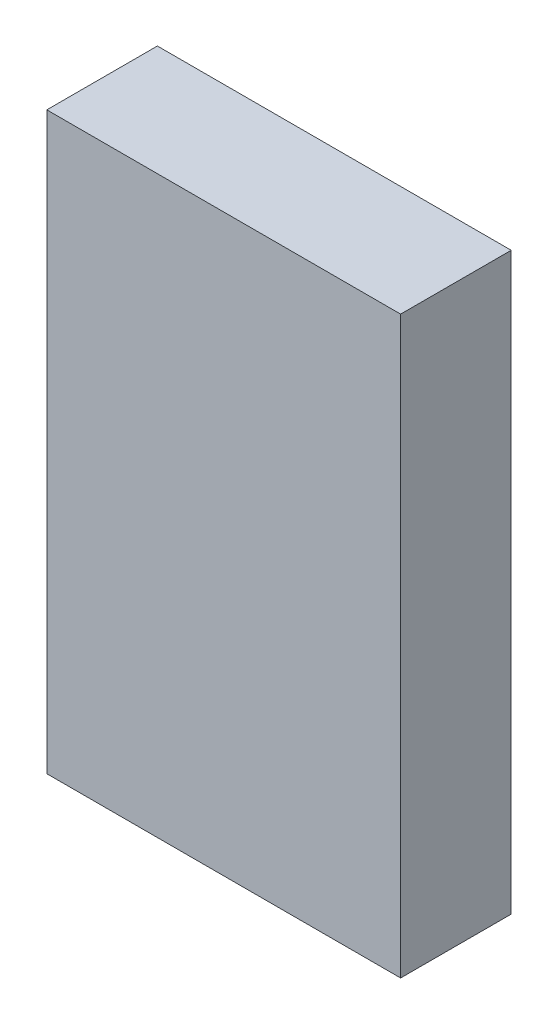
ISO-10303-21;
HEADER;
FILE_DESCRIPTION(('STEP AP214'),'2;1');
FILE_NAME('part.step','',(''),(''),'','','');
FILE_SCHEMA(('AUTOMOTIVE_DESIGN { 1 0 10303 214 1 1 1 1 }'));
ENDSEC;
DATA;
#1=APPLICATION_CONTEXT('core data for automotive mechanical design processes');
#2=APPLICATION_PROTOCOL_DEFINITION('international standard','automotive_design',2000,#1);
#3=PRODUCT_CONTEXT('',#1,'mechanical');
#4=PRODUCT('Part','Part','',(#3));
#5=PRODUCT_RELATED_PRODUCT_CATEGORY('part','',(#4));
#6=PRODUCT_DEFINITION_FORMATION('','',#4);
#7=PRODUCT_DEFINITION_CONTEXT('part definition',#1,'design');
#8=PRODUCT_DEFINITION('design','',#6,#7);
#9=PRODUCT_DEFINITION_SHAPE('','',#8);
#10=(LENGTH_UNIT() NAMED_UNIT(*) SI_UNIT(.MILLI.,.METRE.));
#11=(NAMED_UNIT(*) PLANE_ANGLE_UNIT() SI_UNIT($,.RADIAN.));
#12=(NAMED_UNIT(*) SI_UNIT($,.STERADIAN.) SOLID_ANGLE_UNIT());
#13=UNCERTAINTY_MEASURE_WITH_UNIT(LENGTH_MEASURE(1.E-05),#10,'distance_accuracy_value','');
#14=(GEOMETRIC_REPRESENTATION_CONTEXT(3) GLOBAL_UNCERTAINTY_ASSIGNED_CONTEXT((#13)) GLOBAL_UNIT_ASSIGNED_CONTEXT((#10,
#11,#12)) REPRESENTATION_CONTEXT('',''));
#15=CARTESIAN_POINT('',(0.,0.,0.));
#16=DIRECTION('',(0.,0.,1.));
#17=DIRECTION('',(1.,0.,0.));
#18=AXIS2_PLACEMENT_3D('',#15,#16,#17);
#19=CARTESIAN_POINT('',(4460.,440.,25.));
#20=DIRECTION('',(0.,1.,0.));
#21=DIRECTION('',(0.,0.,1.));
#22=AXIS2_PLACEMENT_3D('',#19,#20,#21);
#23=PLANE('',#22);
#24=DIRECTION('',(1.,0.,0.));
#25=VECTOR('',#24,1.);
#26=CARTESIAN_POINT('',(4460.,440.,0.));
#27=LINE('',#26,#25);
#28=CARTESIAN_POINT('',(4380.,440.,0.));
#29=VERTEX_POINT('',#28);
#30=CARTESIAN_POINT('',(4460.,440.,0.));
#31=VERTEX_POINT('',#30);
#32=EDGE_CURVE('E105',#29,#31,#27,.T.);
#33=ORIENTED_EDGE('',*,*,#32,.T.);
#34=DIRECTION('',(0.,0.,-1.));
#35=VECTOR('',#34,1.);
#36=CARTESIAN_POINT('',(4460.,440.,25.));
#37=LINE('',#36,#35);
#38=CARTESIAN_POINT('',(4460.,440.,25.));
#39=VERTEX_POINT('',#38);
#40=EDGE_CURVE('E11',#39,#31,#37,.T.);
#41=ORIENTED_EDGE('',*,*,#40,.F.);
#42=DIRECTION('',(1.,0.,0.));
#43=VECTOR('',#42,1.);
#44=CARTESIAN_POINT('',(4460.,440.,25.));
#45=LINE('',#44,#43);
#46=CARTESIAN_POINT('',(4380.,440.,25.));
#47=VERTEX_POINT('',#46);
#48=EDGE_CURVE('E89',#47,#39,#45,.T.);
#49=ORIENTED_EDGE('',*,*,#48,.F.);
#50=DIRECTION('',(0.,0.,-1.));
#51=VECTOR('',#50,1.);
#52=CARTESIAN_POINT('',(4380.,440.,25.));
#53=LINE('',#52,#51);
#54=EDGE_CURVE('E97',#47,#29,#53,.T.);
#55=ORIENTED_EDGE('',*,*,#54,.T.);
#56=EDGE_LOOP('',(#33,#41,#49,#55));
#57=FACE_BOUND('',#56,.T.);
#58=ADVANCED_FACE('F39',(#57),#23,.F.);
#59=CARTESIAN_POINT('',(4460.,570.,25.));
#60=DIRECTION('',(-1.,0.,0.));
#61=DIRECTION('',(0.,0.,1.));
#62=AXIS2_PLACEMENT_3D('',#59,#60,#61);
#63=PLANE('',#62);
#64=DIRECTION('',(0.,1.,0.));
#65=VECTOR('',#64,1.);
#66=CARTESIAN_POINT('',(4460.,570.,0.));
#67=LINE('',#66,#65);
#68=CARTESIAN_POINT('',(4460.,570.,0.));
#69=VERTEX_POINT('',#68);
#70=EDGE_CURVE('E92',#31,#69,#67,.T.);
#71=ORIENTED_EDGE('',*,*,#70,.T.);
#72=DIRECTION('',(0.,0.,-1.));
#73=VECTOR('',#72,1.);
#74=CARTESIAN_POINT('',(4460.,570.,25.));
#75=LINE('',#74,#73);
#76=CARTESIAN_POINT('',(4460.,570.,25.));
#77=VERTEX_POINT('',#76);
#78=EDGE_CURVE('E50',#77,#69,#75,.T.);
#79=ORIENTED_EDGE('',*,*,#78,.F.);
#80=DIRECTION('',(0.,1.,0.));
#81=VECTOR('',#80,1.);
#82=CARTESIAN_POINT('',(4460.,570.,25.));
#83=LINE('',#82,#81);
#84=EDGE_CURVE('E82',#39,#77,#83,.T.);
#85=ORIENTED_EDGE('',*,*,#84,.F.);
#86=ORIENTED_EDGE('',*,*,#40,.T.);
#87=EDGE_LOOP('',(#71,#79,#85,#86));
#88=FACE_BOUND('',#87,.T.);
#89=ADVANCED_FACE('F93',(#88),#63,.F.);
#90=CARTESIAN_POINT('',(4380.,570.,25.));
#91=DIRECTION('',(0.,-1.,0.));
#92=DIRECTION('',(0.,0.,-1.));
#93=AXIS2_PLACEMENT_3D('',#90,#91,#92);
#94=PLANE('',#93);
#95=DIRECTION('',(-1.,0.,0.));
#96=VECTOR('',#95,1.);
#97=CARTESIAN_POINT('',(4380.,570.,0.));
#98=LINE('',#97,#96);
#99=CARTESIAN_POINT('',(4380.,570.,0.));
#100=VERTEX_POINT('',#99);
#101=EDGE_CURVE('E72',#69,#100,#98,.T.);
#102=ORIENTED_EDGE('',*,*,#101,.T.);
#103=DIRECTION('',(0.,0.,-1.));
#104=VECTOR('',#103,1.);
#105=CARTESIAN_POINT('',(4380.,570.,25.));
#106=LINE('',#105,#104);
#107=CARTESIAN_POINT('',(4380.,570.,25.));
#108=VERTEX_POINT('',#107);
#109=EDGE_CURVE('E94',#108,#100,#106,.T.);
#110=ORIENTED_EDGE('',*,*,#109,.F.);
#111=DIRECTION('',(-1.,0.,0.));
#112=VECTOR('',#111,1.);
#113=CARTESIAN_POINT('',(4380.,570.,25.));
#114=LINE('',#113,#112);
#115=EDGE_CURVE('E88',#77,#108,#114,.T.);
#116=ORIENTED_EDGE('',*,*,#115,.F.);
#117=ORIENTED_EDGE('',*,*,#78,.T.);
#118=EDGE_LOOP('',(#102,#110,#116,#117));
#119=FACE_BOUND('',#118,.T.);
#120=ADVANCED_FACE('F96',(#119),#94,.F.);
#121=CARTESIAN_POINT('',(4380.,440.,25.));
#122=DIRECTION('',(1.,0.,0.));
#123=DIRECTION('',(0.,0.,-1.));
#124=AXIS2_PLACEMENT_3D('',#121,#122,#123);
#125=PLANE('',#124);
#126=DIRECTION('',(0.,-1.,0.));
#127=VECTOR('',#126,1.);
#128=CARTESIAN_POINT('',(4380.,440.,0.));
#129=LINE('',#128,#127);
#130=EDGE_CURVE('E76',#100,#29,#129,.T.);
#131=ORIENTED_EDGE('',*,*,#130,.T.);
#132=ORIENTED_EDGE('',*,*,#54,.F.);
#133=DIRECTION('',(0.,-1.,0.));
#134=VECTOR('',#133,1.);
#135=CARTESIAN_POINT('',(4380.,440.,25.));
#136=LINE('',#135,#134);
#137=EDGE_CURVE('E54',#108,#47,#136,.T.);
#138=ORIENTED_EDGE('',*,*,#137,.F.);
#139=ORIENTED_EDGE('',*,*,#109,.T.);
#140=EDGE_LOOP('',(#131,#132,#138,#139));
#141=FACE_BOUND('',#140,.T.);
#142=ADVANCED_FACE('F108',(#141),#125,.F.);
#143=CARTESIAN_POINT('',(0.,0.,25.));
#144=DIRECTION('',(0.,0.,-1.));
#145=DIRECTION('',(-1.,0.,0.));
#146=AXIS2_PLACEMENT_3D('',#143,#144,#145);
#147=PLANE('',#146);
#148=ORIENTED_EDGE('',*,*,#48,.T.);
#149=ORIENTED_EDGE('',*,*,#84,.T.);
#150=ORIENTED_EDGE('',*,*,#115,.T.);
#151=ORIENTED_EDGE('',*,*,#137,.T.);
#152=EDGE_LOOP('',(#148,#149,#150,#151));
#153=FACE_BOUND('',#152,.T.);
#154=ADVANCED_FACE('F86',(#153),#147,.F.);
#155=CARTESIAN_POINT('',(0.,0.,0.));
#156=DIRECTION('',(0.,0.,-1.));
#157=DIRECTION('',(-1.,0.,0.));
#158=AXIS2_PLACEMENT_3D('',#155,#156,#157);
#159=PLANE('',#158);
#160=ORIENTED_EDGE('',*,*,#32,.F.);
#161=ORIENTED_EDGE('',*,*,#130,.F.);
#162=ORIENTED_EDGE('',*,*,#101,.F.);
#163=ORIENTED_EDGE('',*,*,#70,.F.);
#164=EDGE_LOOP('',(#160,#161,#162,#163));
#165=FACE_BOUND('',#164,.T.);
#166=ADVANCED_FACE('F115',(#165),#159,.T.);
#167=CLOSED_SHELL('',(#58,#89,#120,#142,#154,#166));
#168=MANIFOLD_SOLID_BREP('B2',#167);
#169=ADVANCED_BREP_SHAPE_REPRESENTATION('',(#18,#168),#14);
#170=SHAPE_DEFINITION_REPRESENTATION(#9,#169);
ENDSEC;
END-ISO-10303-21;
